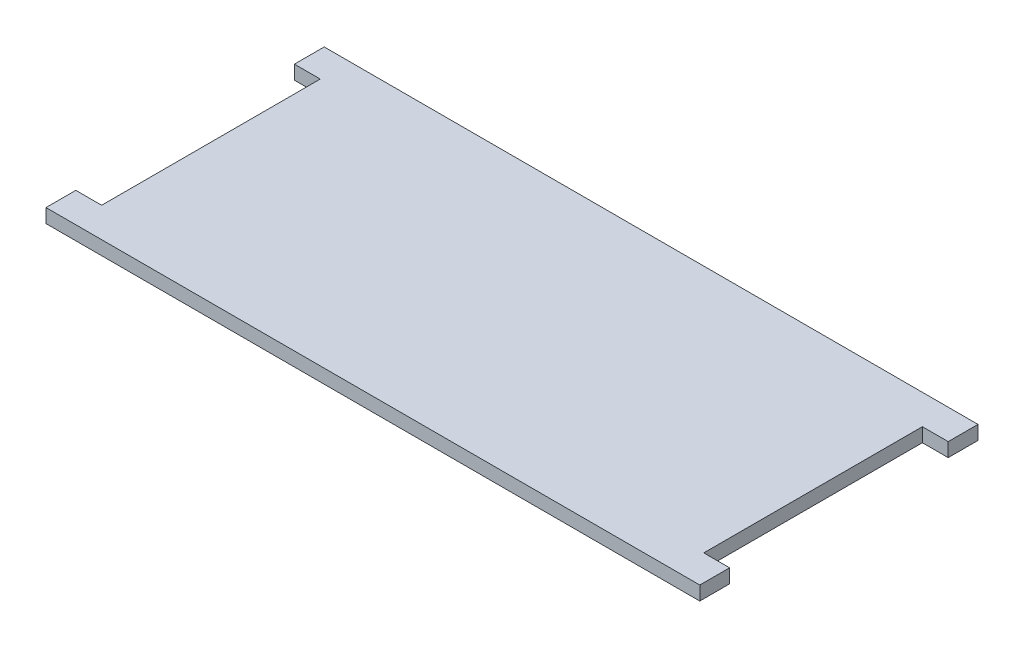
ISO-10303-21;
HEADER;
FILE_DESCRIPTION(('STEP AP214'),'2;1');
FILE_NAME('part.step','',(''),(''),'','','');
FILE_SCHEMA(('AUTOMOTIVE_DESIGN { 1 0 10303 214 1 1 1 1 }'));
ENDSEC;
DATA;
#1=APPLICATION_CONTEXT('core data for automotive mechanical design processes');
#2=APPLICATION_PROTOCOL_DEFINITION('international standard','automotive_design',2000,#1);
#3=PRODUCT_CONTEXT('',#1,'mechanical');
#4=PRODUCT('Part','Part','',(#3));
#5=PRODUCT_RELATED_PRODUCT_CATEGORY('part','',(#4));
#6=PRODUCT_DEFINITION_FORMATION('','',#4);
#7=PRODUCT_DEFINITION_CONTEXT('part definition',#1,'design');
#8=PRODUCT_DEFINITION('design','',#6,#7);
#9=PRODUCT_DEFINITION_SHAPE('','',#8);
#10=(LENGTH_UNIT() NAMED_UNIT(*) SI_UNIT(.MILLI.,.METRE.));
#11=(NAMED_UNIT(*) PLANE_ANGLE_UNIT() SI_UNIT($,.RADIAN.));
#12=(NAMED_UNIT(*) SI_UNIT($,.STERADIAN.) SOLID_ANGLE_UNIT());
#13=UNCERTAINTY_MEASURE_WITH_UNIT(LENGTH_MEASURE(1.E-05),#10,'distance_accuracy_value','');
#14=(GEOMETRIC_REPRESENTATION_CONTEXT(3) GLOBAL_UNCERTAINTY_ASSIGNED_CONTEXT((#13)) GLOBAL_UNIT_ASSIGNED_CONTEXT((#10,
#11,#12)) REPRESENTATION_CONTEXT('',''));
#15=CARTESIAN_POINT('',(0.,0.,0.));
#16=DIRECTION('',(0.,0.,1.));
#17=DIRECTION('',(1.,0.,0.));
#18=AXIS2_PLACEMENT_3D('',#15,#16,#17);
#19=CARTESIAN_POINT('',(329.,0.,0.));
#20=DIRECTION('',(-1.,0.,0.));
#21=DIRECTION('',(0.,0.,1.));
#22=AXIS2_PLACEMENT_3D('',#19,#20,#21);
#23=PLANE('',#22);
#24=DIRECTION('',(0.,0.,-1.));
#25=VECTOR('',#24,1.);
#26=CARTESIAN_POINT('',(329.,-3.5,70.));
#27=LINE('',#26,#25);
#28=CARTESIAN_POINT('',(329.,-3.5,70.));
#29=VERTEX_POINT('',#28);
#30=CARTESIAN_POINT('',(329.,-3.5,55.));
#31=VERTEX_POINT('',#30);
#32=EDGE_CURVE('E186',#29,#31,#27,.T.);
#33=ORIENTED_EDGE('',*,*,#32,.T.);
#34=DIRECTION('',(0.,1.,0.));
#35=VECTOR('',#34,1.);
#36=CARTESIAN_POINT('',(329.,0.,55.));
#37=LINE('',#36,#35);
#38=CARTESIAN_POINT('',(329.,3.5,55.));
#39=VERTEX_POINT('',#38);
#40=EDGE_CURVE('E199',#31,#39,#37,.T.);
#41=ORIENTED_EDGE('',*,*,#40,.T.);
#42=DIRECTION('',(0.,0.,1.));
#43=VECTOR('',#42,1.);
#44=CARTESIAN_POINT('',(329.,3.5,70.));
#45=LINE('',#44,#43);
#46=CARTESIAN_POINT('',(329.,3.5,70.));
#47=VERTEX_POINT('',#46);
#48=EDGE_CURVE('E251',#39,#47,#45,.T.);
#49=ORIENTED_EDGE('',*,*,#48,.T.);
#50=DIRECTION('',(0.,-1.,0.));
#51=VECTOR('',#50,1.);
#52=CARTESIAN_POINT('',(329.,-3.5,70.));
#53=LINE('',#52,#51);
#54=EDGE_CURVE('E256',#47,#29,#53,.T.);
#55=ORIENTED_EDGE('',*,*,#54,.T.);
#56=EDGE_LOOP('',(#33,#41,#49,#55));
#57=FACE_BOUND('',#56,.T.);
#58=ADVANCED_FACE('F45',(#57),#23,.F.);
#59=CARTESIAN_POINT('',(0.,0.,0.));
#60=DIRECTION('',(-1.,0.,0.));
#61=DIRECTION('',(0.,0.,1.));
#62=AXIS2_PLACEMENT_3D('',#59,#60,#61);
#63=PLANE('',#62);
#64=DIRECTION('',(0.,-1.,0.));
#65=VECTOR('',#64,1.);
#66=CARTESIAN_POINT('',(0.,0.,-55.));
#67=LINE('',#66,#65);
#68=CARTESIAN_POINT('',(0.,3.5,-55.));
#69=VERTEX_POINT('',#68);
#70=CARTESIAN_POINT('',(0.,-3.5,-55.));
#71=VERTEX_POINT('',#70);
#72=EDGE_CURVE('E145',#69,#71,#67,.T.);
#73=ORIENTED_EDGE('',*,*,#72,.F.);
#74=DIRECTION('',(0.,0.,1.));
#75=VECTOR('',#74,1.);
#76=CARTESIAN_POINT('',(0.,3.5,70.));
#77=LINE('',#76,#75);
#78=CARTESIAN_POINT('',(0.,3.5,-70.));
#79=VERTEX_POINT('',#78);
#80=EDGE_CURVE('E164',#79,#69,#77,.T.);
#81=ORIENTED_EDGE('',*,*,#80,.F.);
#82=DIRECTION('',(0.,1.,0.));
#83=VECTOR('',#82,1.);
#84=CARTESIAN_POINT('',(0.,-3.5,-70.));
#85=LINE('',#84,#83);
#86=CARTESIAN_POINT('',(0.,-3.5,-70.));
#87=VERTEX_POINT('',#86);
#88=EDGE_CURVE('E165',#87,#79,#85,.T.);
#89=ORIENTED_EDGE('',*,*,#88,.F.);
#90=DIRECTION('',(0.,0.,-1.));
#91=VECTOR('',#90,1.);
#92=CARTESIAN_POINT('',(0.,-3.5,70.));
#93=LINE('',#92,#91);
#94=EDGE_CURVE('E177',#71,#87,#93,.T.);
#95=ORIENTED_EDGE('',*,*,#94,.F.);
#96=EDGE_LOOP('',(#73,#81,#89,#95));
#97=FACE_BOUND('',#96,.T.);
#98=ADVANCED_FACE('F273',(#97),#63,.T.);
#99=CARTESIAN_POINT('',(329.,-3.5,-70.));
#100=DIRECTION('',(0.,0.,1.));
#101=DIRECTION('',(1.,0.,0.));
#102=AXIS2_PLACEMENT_3D('',#99,#100,#101);
#103=PLANE('',#102);
#104=DIRECTION('',(-1.,0.,0.));
#105=VECTOR('',#104,1.);
#106=CARTESIAN_POINT('',(329.,-3.5,-70.));
#107=LINE('',#106,#105);
#108=CARTESIAN_POINT('',(329.,-3.5,-70.));
#109=VERTEX_POINT('',#108);
#110=EDGE_CURVE('E182',#109,#87,#107,.T.);
#111=ORIENTED_EDGE('',*,*,#110,.T.);
#112=ORIENTED_EDGE('',*,*,#88,.T.);
#113=DIRECTION('',(-1.,0.,0.));
#114=VECTOR('',#113,1.);
#115=CARTESIAN_POINT('',(329.,3.5,-70.));
#116=LINE('',#115,#114);
#117=CARTESIAN_POINT('',(329.,3.5,-70.));
#118=VERTEX_POINT('',#117);
#119=EDGE_CURVE('E146',#118,#79,#116,.T.);
#120=ORIENTED_EDGE('',*,*,#119,.F.);
#121=DIRECTION('',(0.,1.,0.));
#122=VECTOR('',#121,1.);
#123=CARTESIAN_POINT('',(329.,-3.5,-70.));
#124=LINE('',#123,#122);
#125=EDGE_CURVE('E181',#109,#118,#124,.T.);
#126=ORIENTED_EDGE('',*,*,#125,.F.);
#127=EDGE_LOOP('',(#111,#112,#120,#126));
#128=FACE_BOUND('',#127,.T.);
#129=ADVANCED_FACE('F47',(#128),#103,.F.);
#130=CARTESIAN_POINT('',(329.,3.5,70.));
#131=DIRECTION('',(0.,-1.,0.));
#132=DIRECTION('',(0.,0.,-1.));
#133=AXIS2_PLACEMENT_3D('',#130,#131,#132);
#134=PLANE('',#133);
#135=ORIENTED_EDGE('',*,*,#119,.T.);
#136=ORIENTED_EDGE('',*,*,#80,.T.);
#137=DIRECTION('',(-1.,0.,0.));
#138=VECTOR('',#137,1.);
#139=CARTESIAN_POINT('',(0.,3.5,-55.));
#140=LINE('',#139,#138);
#141=CARTESIAN_POINT('',(13.,3.5,-55.));
#142=VERTEX_POINT('',#141);
#143=EDGE_CURVE('E277',#142,#69,#140,.T.);
#144=ORIENTED_EDGE('',*,*,#143,.F.);
#145=DIRECTION('',(0.,0.,-1.));
#146=VECTOR('',#145,1.);
#147=CARTESIAN_POINT('',(13.,3.5,-55.));
#148=LINE('',#147,#146);
#149=CARTESIAN_POINT('',(13.,3.5,55.));
#150=VERTEX_POINT('',#149);
#151=EDGE_CURVE('E156',#150,#142,#148,.T.);
#152=ORIENTED_EDGE('',*,*,#151,.F.);
#153=DIRECTION('',(1.,0.,0.));
#154=VECTOR('',#153,1.);
#155=CARTESIAN_POINT('',(0.,3.5,55.));
#156=LINE('',#155,#154);
#157=CARTESIAN_POINT('',(0.,3.5,55.));
#158=VERTEX_POINT('',#157);
#159=EDGE_CURVE('E138',#158,#150,#156,.T.);
#160=ORIENTED_EDGE('',*,*,#159,.F.);
#161=CARTESIAN_POINT('',(0.,3.5,70.));
#162=VERTEX_POINT('',#161);
#163=EDGE_CURVE('E152',#158,#162,#77,.T.);
#164=ORIENTED_EDGE('',*,*,#163,.T.);
#165=DIRECTION('',(-1.,0.,0.));
#166=VECTOR('',#165,1.);
#167=CARTESIAN_POINT('',(329.,3.5,70.));
#168=LINE('',#167,#166);
#169=EDGE_CURVE('E189',#47,#162,#168,.T.);
#170=ORIENTED_EDGE('',*,*,#169,.F.);
#171=ORIENTED_EDGE('',*,*,#48,.F.);
#172=DIRECTION('',(1.,0.,0.));
#173=VECTOR('',#172,1.);
#174=CARTESIAN_POINT('',(329.,3.5,55.));
#175=LINE('',#174,#173);
#176=CARTESIAN_POINT('',(316.,3.5,55.));
#177=VERTEX_POINT('',#176);
#178=EDGE_CURVE('E222',#177,#39,#175,.T.);
#179=ORIENTED_EDGE('',*,*,#178,.F.);
#180=DIRECTION('',(0.,0.,1.));
#181=VECTOR('',#180,1.);
#182=CARTESIAN_POINT('',(316.,3.5,-55.));
#183=LINE('',#182,#181);
#184=CARTESIAN_POINT('',(316.,3.5,-55.));
#185=VERTEX_POINT('',#184);
#186=EDGE_CURVE('E226',#185,#177,#183,.T.);
#187=ORIENTED_EDGE('',*,*,#186,.F.);
#188=DIRECTION('',(-1.,0.,0.));
#189=VECTOR('',#188,1.);
#190=CARTESIAN_POINT('',(329.,3.5,-55.));
#191=LINE('',#190,#189);
#192=CARTESIAN_POINT('',(329.,3.5,-55.));
#193=VERTEX_POINT('',#192);
#194=EDGE_CURVE('E158',#193,#185,#191,.T.);
#195=ORIENTED_EDGE('',*,*,#194,.F.);
#196=EDGE_CURVE('E252',#118,#193,#45,.T.);
#197=ORIENTED_EDGE('',*,*,#196,.F.);
#198=EDGE_LOOP('',(#135,#136,#144,#152,#160,#164,#170,#171,#179,#187,#195,#197));
#199=FACE_BOUND('',#198,.T.);
#200=ADVANCED_FACE('F150',(#199),#134,.F.);
#201=CARTESIAN_POINT('',(329.,-3.5,70.));
#202=DIRECTION('',(0.,0.,-1.));
#203=DIRECTION('',(-1.,0.,0.));
#204=AXIS2_PLACEMENT_3D('',#201,#202,#203);
#205=PLANE('',#204);
#206=ORIENTED_EDGE('',*,*,#169,.T.);
#207=DIRECTION('',(0.,-1.,0.));
#208=VECTOR('',#207,1.);
#209=CARTESIAN_POINT('',(0.,-3.5,70.));
#210=LINE('',#209,#208);
#211=CARTESIAN_POINT('',(0.,-3.5,70.));
#212=VERTEX_POINT('',#211);
#213=EDGE_CURVE('E162',#162,#212,#210,.T.);
#214=ORIENTED_EDGE('',*,*,#213,.T.);
#215=DIRECTION('',(-1.,0.,0.));
#216=VECTOR('',#215,1.);
#217=CARTESIAN_POINT('',(329.,-3.5,70.));
#218=LINE('',#217,#216);
#219=EDGE_CURVE('E185',#29,#212,#218,.T.);
#220=ORIENTED_EDGE('',*,*,#219,.F.);
#221=ORIENTED_EDGE('',*,*,#54,.F.);
#222=EDGE_LOOP('',(#206,#214,#220,#221));
#223=FACE_BOUND('',#222,.T.);
#224=ADVANCED_FACE('F305',(#223),#205,.F.);
#225=CARTESIAN_POINT('',(329.,-3.5,70.));
#226=DIRECTION('',(0.,1.,0.));
#227=DIRECTION('',(0.,0.,1.));
#228=AXIS2_PLACEMENT_3D('',#225,#226,#227);
#229=PLANE('',#228);
#230=ORIENTED_EDGE('',*,*,#94,.T.);
#231=ORIENTED_EDGE('',*,*,#110,.F.);
#232=CARTESIAN_POINT('',(329.,-3.5,-55.));
#233=VERTEX_POINT('',#232);
#234=EDGE_CURVE('E258',#233,#109,#27,.T.);
#235=ORIENTED_EDGE('',*,*,#234,.F.);
#236=DIRECTION('',(-1.,0.,0.));
#237=VECTOR('',#236,1.);
#238=CARTESIAN_POINT('',(329.,-3.5,-55.));
#239=LINE('',#238,#237);
#240=CARTESIAN_POINT('',(316.,-3.5,-55.));
#241=VERTEX_POINT('',#240);
#242=EDGE_CURVE('E61',#233,#241,#239,.T.);
#243=ORIENTED_EDGE('',*,*,#242,.T.);
#244=DIRECTION('',(0.,0.,1.));
#245=VECTOR('',#244,1.);
#246=CARTESIAN_POINT('',(316.,-3.5,70.));
#247=LINE('',#246,#245);
#248=CARTESIAN_POINT('',(316.,-3.5,55.));
#249=VERTEX_POINT('',#248);
#250=EDGE_CURVE('E54',#241,#249,#247,.T.);
#251=ORIENTED_EDGE('',*,*,#250,.T.);
#252=DIRECTION('',(1.,0.,0.));
#253=VECTOR('',#252,1.);
#254=CARTESIAN_POINT('',(329.,-3.5,55.));
#255=LINE('',#254,#253);
#256=EDGE_CURVE('E171',#249,#31,#255,.T.);
#257=ORIENTED_EDGE('',*,*,#256,.T.);
#258=ORIENTED_EDGE('',*,*,#32,.F.);
#259=ORIENTED_EDGE('',*,*,#219,.T.);
#260=CARTESIAN_POINT('',(0.,-3.5,55.));
#261=VERTEX_POINT('',#260);
#262=EDGE_CURVE('E178',#212,#261,#93,.T.);
#263=ORIENTED_EDGE('',*,*,#262,.T.);
#264=DIRECTION('',(1.,0.,0.));
#265=VECTOR('',#264,1.);
#266=CARTESIAN_POINT('',(329.,-3.5,55.));
#267=LINE('',#266,#265);
#268=CARTESIAN_POINT('',(13.,-3.5,55.));
#269=VERTEX_POINT('',#268);
#270=EDGE_CURVE('E69',#261,#269,#267,.T.);
#271=ORIENTED_EDGE('',*,*,#270,.T.);
#272=DIRECTION('',(0.,0.,-1.));
#273=VECTOR('',#272,1.);
#274=CARTESIAN_POINT('',(13.,-3.5,70.));
#275=LINE('',#274,#273);
#276=CARTESIAN_POINT('',(13.,-3.5,-55.));
#277=VERTEX_POINT('',#276);
#278=EDGE_CURVE('E11',#269,#277,#275,.T.);
#279=ORIENTED_EDGE('',*,*,#278,.T.);
#280=DIRECTION('',(-1.,0.,0.));
#281=VECTOR('',#280,1.);
#282=CARTESIAN_POINT('',(329.,-3.5,-55.));
#283=LINE('',#282,#281);
#284=EDGE_CURVE('E239',#277,#71,#283,.T.);
#285=ORIENTED_EDGE('',*,*,#284,.T.);
#286=EDGE_LOOP('',(#230,#231,#235,#243,#251,#257,#258,#259,#263,#271,#279,#285));
#287=FACE_BOUND('',#286,.T.);
#288=ADVANCED_FACE('F207',(#287),#229,.F.);
#289=ORIENTED_EDGE('',*,*,#196,.T.);
#290=DIRECTION('',(0.,-1.,0.));
#291=VECTOR('',#290,1.);
#292=CARTESIAN_POINT('',(329.,0.,-55.));
#293=LINE('',#292,#291);
#294=EDGE_CURVE('E196',#193,#233,#293,.T.);
#295=ORIENTED_EDGE('',*,*,#294,.T.);
#296=ORIENTED_EDGE('',*,*,#234,.T.);
#297=ORIENTED_EDGE('',*,*,#125,.T.);
#298=EDGE_LOOP('',(#289,#295,#296,#297));
#299=FACE_BOUND('',#298,.T.);
#300=ADVANCED_FACE('F264',(#299),#23,.F.);
#301=DIRECTION('',(0.,1.,0.));
#302=VECTOR('',#301,1.);
#303=CARTESIAN_POINT('',(0.,0.,55.));
#304=LINE('',#303,#302);
#305=EDGE_CURVE('E135',#261,#158,#304,.T.);
#306=ORIENTED_EDGE('',*,*,#305,.F.);
#307=ORIENTED_EDGE('',*,*,#262,.F.);
#308=ORIENTED_EDGE('',*,*,#213,.F.);
#309=ORIENTED_EDGE('',*,*,#163,.F.);
#310=EDGE_LOOP('',(#306,#307,#308,#309));
#311=FACE_BOUND('',#310,.T.);
#312=ADVANCED_FACE('F160',(#311),#63,.T.);
#313=CARTESIAN_POINT('',(13.,-92.5,-55.));
#314=DIRECTION('',(1.,0.,0.));
#315=DIRECTION('',(0.,0.,-1.));
#316=AXIS2_PLACEMENT_3D('',#313,#314,#315);
#317=PLANE('',#316);
#318=DIRECTION('',(0.,1.,0.));
#319=VECTOR('',#318,1.);
#320=CARTESIAN_POINT('',(13.,-92.5,55.));
#321=LINE('',#320,#319);
#322=EDGE_CURVE('E230',#269,#150,#321,.T.);
#323=ORIENTED_EDGE('',*,*,#322,.T.);
#324=ORIENTED_EDGE('',*,*,#151,.T.);
#325=DIRECTION('',(0.,1.,0.));
#326=VECTOR('',#325,1.);
#327=CARTESIAN_POINT('',(13.,-92.5,-55.));
#328=LINE('',#327,#326);
#329=EDGE_CURVE('E240',#277,#142,#328,.T.);
#330=ORIENTED_EDGE('',*,*,#329,.F.);
#331=ORIENTED_EDGE('',*,*,#278,.F.);
#332=EDGE_LOOP('',(#323,#324,#330,#331));
#333=FACE_BOUND('',#332,.T.);
#334=ADVANCED_FACE('F279',(#333),#317,.F.);
#335=CARTESIAN_POINT('',(0.,-92.5,-55.));
#336=DIRECTION('',(0.,0.,-1.));
#337=DIRECTION('',(-1.,0.,0.));
#338=AXIS2_PLACEMENT_3D('',#335,#336,#337);
#339=PLANE('',#338);
#340=ORIENTED_EDGE('',*,*,#329,.T.);
#341=ORIENTED_EDGE('',*,*,#143,.T.);
#342=ORIENTED_EDGE('',*,*,#72,.T.);
#343=ORIENTED_EDGE('',*,*,#284,.F.);
#344=EDGE_LOOP('',(#340,#341,#342,#343));
#345=FACE_BOUND('',#344,.T.);
#346=ADVANCED_FACE('F275',(#345),#339,.F.);
#347=CARTESIAN_POINT('',(0.,-92.5,55.));
#348=DIRECTION('',(0.,0.,1.));
#349=DIRECTION('',(1.,0.,0.));
#350=AXIS2_PLACEMENT_3D('',#347,#348,#349);
#351=PLANE('',#350);
#352=ORIENTED_EDGE('',*,*,#305,.T.);
#353=ORIENTED_EDGE('',*,*,#159,.T.);
#354=ORIENTED_EDGE('',*,*,#322,.F.);
#355=ORIENTED_EDGE('',*,*,#270,.F.);
#356=EDGE_LOOP('',(#352,#353,#354,#355));
#357=FACE_BOUND('',#356,.T.);
#358=ADVANCED_FACE('F137',(#357),#351,.F.);
#359=CARTESIAN_POINT('',(316.,-92.5,-55.));
#360=DIRECTION('',(-1.,0.,0.));
#361=DIRECTION('',(0.,0.,1.));
#362=AXIS2_PLACEMENT_3D('',#359,#360,#361);
#363=PLANE('',#362);
#364=DIRECTION('',(0.,1.,0.));
#365=VECTOR('',#364,1.);
#366=CARTESIAN_POINT('',(316.,-92.5,-55.));
#367=LINE('',#366,#365);
#368=EDGE_CURVE('E215',#241,#185,#367,.T.);
#369=ORIENTED_EDGE('',*,*,#368,.T.);
#370=ORIENTED_EDGE('',*,*,#186,.T.);
#371=DIRECTION('',(0.,1.,0.));
#372=VECTOR('',#371,1.);
#373=CARTESIAN_POINT('',(316.,-92.5,55.));
#374=LINE('',#373,#372);
#375=EDGE_CURVE('E217',#249,#177,#374,.T.);
#376=ORIENTED_EDGE('',*,*,#375,.F.);
#377=ORIENTED_EDGE('',*,*,#250,.F.);
#378=EDGE_LOOP('',(#369,#370,#376,#377));
#379=FACE_BOUND('',#378,.T.);
#380=ADVANCED_FACE('F213',(#379),#363,.F.);
#381=CARTESIAN_POINT('',(329.,-92.5,55.));
#382=DIRECTION('',(0.,0.,1.));
#383=DIRECTION('',(1.,0.,0.));
#384=AXIS2_PLACEMENT_3D('',#381,#382,#383);
#385=PLANE('',#384);
#386=ORIENTED_EDGE('',*,*,#375,.T.);
#387=ORIENTED_EDGE('',*,*,#178,.T.);
#388=ORIENTED_EDGE('',*,*,#40,.F.);
#389=ORIENTED_EDGE('',*,*,#256,.F.);
#390=EDGE_LOOP('',(#386,#387,#388,#389));
#391=FACE_BOUND('',#390,.T.);
#392=ADVANCED_FACE('F326',(#391),#385,.F.);
#393=CARTESIAN_POINT('',(329.,-92.5,-55.));
#394=DIRECTION('',(0.,0.,-1.));
#395=DIRECTION('',(-1.,0.,0.));
#396=AXIS2_PLACEMENT_3D('',#393,#394,#395);
#397=PLANE('',#396);
#398=ORIENTED_EDGE('',*,*,#294,.F.);
#399=ORIENTED_EDGE('',*,*,#194,.T.);
#400=ORIENTED_EDGE('',*,*,#368,.F.);
#401=ORIENTED_EDGE('',*,*,#242,.F.);
#402=EDGE_LOOP('',(#398,#399,#400,#401));
#403=FACE_BOUND('',#402,.T.);
#404=ADVANCED_FACE('F218',(#403),#397,.F.);
#405=CLOSED_SHELL('',(#58,#98,#129,#200,#224,#288,#300,#312,#334,#346,#358,#380,#392,#404));
#406=MANIFOLD_SOLID_BREP('B2',#405);
#407=ADVANCED_BREP_SHAPE_REPRESENTATION('',(#18,#406),#14);
#408=SHAPE_DEFINITION_REPRESENTATION(#9,#407);
ENDSEC;
END-ISO-10303-21;
